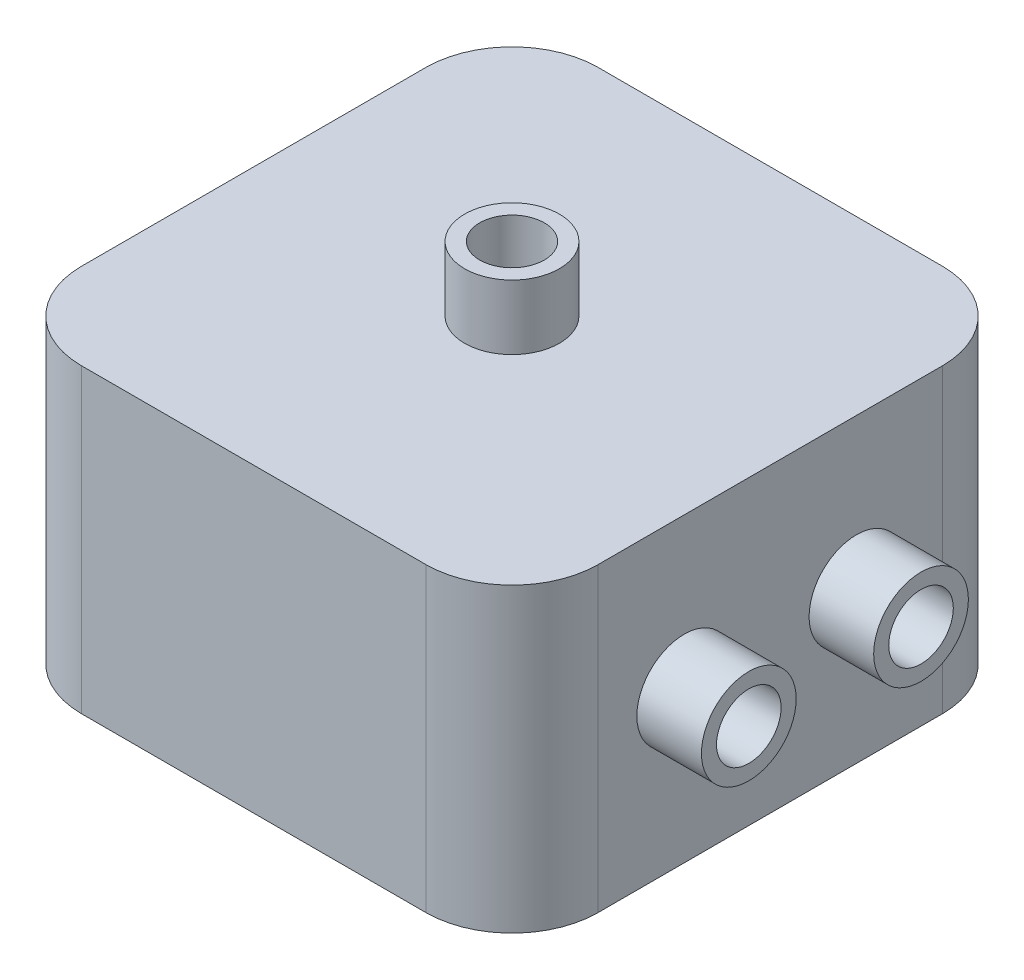
ISO-10303-21;
HEADER;
FILE_DESCRIPTION(('STEP AP214'),'2;1');
FILE_NAME('part.step','',(''),(''),'','','');
FILE_SCHEMA(('AUTOMOTIVE_DESIGN { 1 0 10303 214 1 1 1 1 }'));
ENDSEC;
DATA;
#1=APPLICATION_CONTEXT('core data for automotive mechanical design processes');
#2=APPLICATION_PROTOCOL_DEFINITION('international standard','automotive_design',2000,#1);
#3=PRODUCT_CONTEXT('',#1,'mechanical');
#4=PRODUCT('Part','Part','',(#3));
#5=PRODUCT_RELATED_PRODUCT_CATEGORY('part','',(#4));
#6=PRODUCT_DEFINITION_FORMATION('','',#4);
#7=PRODUCT_DEFINITION_CONTEXT('part definition',#1,'design');
#8=PRODUCT_DEFINITION('design','',#6,#7);
#9=PRODUCT_DEFINITION_SHAPE('','',#8);
#10=(LENGTH_UNIT() NAMED_UNIT(*) SI_UNIT(.MILLI.,.METRE.));
#11=(NAMED_UNIT(*) PLANE_ANGLE_UNIT() SI_UNIT($,.RADIAN.));
#12=(NAMED_UNIT(*) SI_UNIT($,.STERADIAN.) SOLID_ANGLE_UNIT());
#13=UNCERTAINTY_MEASURE_WITH_UNIT(LENGTH_MEASURE(1.E-05),#10,'distance_accuracy_value','');
#14=(GEOMETRIC_REPRESENTATION_CONTEXT(3) GLOBAL_UNCERTAINTY_ASSIGNED_CONTEXT((#13)) GLOBAL_UNIT_ASSIGNED_CONTEXT((#10,
#11,#12)) REPRESENTATION_CONTEXT('',''));
#15=CARTESIAN_POINT('',(0.,0.,0.));
#16=DIRECTION('',(0.,0.,1.));
#17=DIRECTION('',(1.,0.,0.));
#18=AXIS2_PLACEMENT_3D('',#15,#16,#17);
#19=CARTESIAN_POINT('',(40.,50.,-40.));
#20=DIRECTION('',(0.,-1.,0.));
#21=DIRECTION('',(0.,0.,-1.));
#22=AXIS2_PLACEMENT_3D('',#19,#20,#21);
#23=CYLINDRICAL_SURFACE('',#22,20.);
#24=DIRECTION('',(0.,-1.,0.));
#25=VECTOR('',#24,1.);
#26=CARTESIAN_POINT('',(60.,50.,-40.));
#27=LINE('',#26,#25);
#28=CARTESIAN_POINT('',(60.,60.,-40.));
#29=VERTEX_POINT('',#28);
#30=CARTESIAN_POINT('',(60.,-10.,-40.));
#31=VERTEX_POINT('',#30);
#32=EDGE_CURVE('E128',#29,#31,#27,.T.);
#33=ORIENTED_EDGE('',*,*,#32,.T.);
#34=CARTESIAN_POINT('',(40.,-10.,-40.));
#35=DIRECTION('',(0.,-1.,0.));
#36=DIRECTION('',(0.,0.,-1.));
#37=AXIS2_PLACEMENT_3D('',#34,#35,#36);
#38=CIRCLE('',#37,20.);
#39=CARTESIAN_POINT('',(40.,-10.,-60.));
#40=VERTEX_POINT('',#39);
#41=EDGE_CURVE('E212',#40,#31,#38,.T.);
#42=ORIENTED_EDGE('',*,*,#41,.F.);
#43=DIRECTION('',(0.,-1.,0.));
#44=VECTOR('',#43,1.);
#45=CARTESIAN_POINT('',(40.,50.,-60.));
#46=LINE('',#45,#44);
#47=CARTESIAN_POINT('',(40.,60.,-60.));
#48=VERTEX_POINT('',#47);
#49=EDGE_CURVE('E149',#48,#40,#46,.T.);
#50=ORIENTED_EDGE('',*,*,#49,.F.);
#51=CARTESIAN_POINT('',(40.,60.,-40.));
#52=DIRECTION('',(0.,1.,0.));
#53=DIRECTION('',(0.,0.,-1.));
#54=AXIS2_PLACEMENT_3D('',#51,#52,#53);
#55=CIRCLE('',#54,20.);
#56=EDGE_CURVE('E236',#29,#48,#55,.T.);
#57=ORIENTED_EDGE('',*,*,#56,.F.);
#58=EDGE_LOOP('',(#33,#42,#50,#57));
#59=FACE_BOUND('',#58,.T.);
#60=ADVANCED_FACE('F34',(#59),#23,.T.);
#61=CARTESIAN_POINT('',(40.,50.,-60.));
#62=DIRECTION('',(0.,0.,1.));
#63=DIRECTION('',(1.,0.,0.));
#64=AXIS2_PLACEMENT_3D('',#61,#62,#63);
#65=PLANE('',#64);
#66=ORIENTED_EDGE('',*,*,#49,.T.);
#67=DIRECTION('',(1.,0.,0.));
#68=VECTOR('',#67,1.);
#69=CARTESIAN_POINT('',(-40.,-10.,-60.));
#70=LINE('',#69,#68);
#71=CARTESIAN_POINT('',(-40.,-10.,-60.));
#72=VERTEX_POINT('',#71);
#73=EDGE_CURVE('E209',#72,#40,#70,.T.);
#74=ORIENTED_EDGE('',*,*,#73,.F.);
#75=DIRECTION('',(0.,-1.,0.));
#76=VECTOR('',#75,1.);
#77=CARTESIAN_POINT('',(-40.,50.,-60.));
#78=LINE('',#77,#76);
#79=CARTESIAN_POINT('',(-40.,60.,-60.));
#80=VERTEX_POINT('',#79);
#81=EDGE_CURVE('E146',#80,#72,#78,.T.);
#82=ORIENTED_EDGE('',*,*,#81,.F.);
#83=DIRECTION('',(-1.,0.,0.));
#84=VECTOR('',#83,1.);
#85=CARTESIAN_POINT('',(-40.,60.,-60.));
#86=LINE('',#85,#84);
#87=EDGE_CURVE('E239',#48,#80,#86,.T.);
#88=ORIENTED_EDGE('',*,*,#87,.F.);
#89=EDGE_LOOP('',(#66,#74,#82,#88));
#90=FACE_BOUND('',#89,.T.);
#91=ADVANCED_FACE('F380',(#90),#65,.F.);
#92=CARTESIAN_POINT('',(-40.,50.,-40.));
#93=DIRECTION('',(0.,-1.,0.));
#94=DIRECTION('',(0.,0.,-1.));
#95=AXIS2_PLACEMENT_3D('',#92,#93,#94);
#96=CYLINDRICAL_SURFACE('',#95,20.);
#97=ORIENTED_EDGE('',*,*,#81,.T.);
#98=CARTESIAN_POINT('',(-40.,-10.,-40.));
#99=DIRECTION('',(0.,-1.,0.));
#100=DIRECTION('',(0.,0.,-1.));
#101=AXIS2_PLACEMENT_3D('',#98,#99,#100);
#102=CIRCLE('',#101,20.);
#103=CARTESIAN_POINT('',(-60.,-10.,-40.));
#104=VERTEX_POINT('',#103);
#105=EDGE_CURVE('E206',#104,#72,#102,.T.);
#106=ORIENTED_EDGE('',*,*,#105,.F.);
#107=DIRECTION('',(0.,-1.,0.));
#108=VECTOR('',#107,1.);
#109=CARTESIAN_POINT('',(-60.,50.,-40.));
#110=LINE('',#109,#108);
#111=CARTESIAN_POINT('',(-60.,60.,-40.));
#112=VERTEX_POINT('',#111);
#113=EDGE_CURVE('E143',#112,#104,#110,.T.);
#114=ORIENTED_EDGE('',*,*,#113,.F.);
#115=CARTESIAN_POINT('',(-40.,60.,-40.));
#116=DIRECTION('',(0.,1.,0.));
#117=DIRECTION('',(0.,0.,1.));
#118=AXIS2_PLACEMENT_3D('',#115,#116,#117);
#119=CIRCLE('',#118,20.);
#120=EDGE_CURVE('E242',#80,#112,#119,.T.);
#121=ORIENTED_EDGE('',*,*,#120,.F.);
#122=EDGE_LOOP('',(#97,#106,#114,#121));
#123=FACE_BOUND('',#122,.T.);
#124=ADVANCED_FACE('F379',(#123),#96,.T.);
#125=CARTESIAN_POINT('',(-60.,50.,40.));
#126=DIRECTION('',(1.,0.,0.));
#127=DIRECTION('',(0.,0.,-1.));
#128=AXIS2_PLACEMENT_3D('',#125,#126,#127);
#129=PLANE('',#128);
#130=CARTESIAN_POINT('',(-60.,25.,-19.9999999999999));
#131=DIRECTION('',(1.,0.,0.));
#132=DIRECTION('',(0.,0.,-1.));
#133=AXIS2_PLACEMENT_3D('',#130,#131,#132);
#134=CIRCLE('',#133,11.);
#135=CARTESIAN_POINT('',(-60.,25.,-30.9999999999999));
#136=VERTEX_POINT('',#135);
#137=EDGE_CURVE('E155',#136,#136,#134,.F.);
#138=ORIENTED_EDGE('',*,*,#137,.F.);
#139=EDGE_LOOP('',(#138));
#140=FACE_BOUND('',#139,.T.);
#141=CARTESIAN_POINT('',(-60.,25.,20.));
#142=DIRECTION('',(1.,0.,0.));
#143=DIRECTION('',(0.,0.,-1.));
#144=AXIS2_PLACEMENT_3D('',#141,#142,#143);
#145=CIRCLE('',#144,11.);
#146=CARTESIAN_POINT('',(-60.,25.,8.99999999999996));
#147=VERTEX_POINT('',#146);
#148=EDGE_CURVE('E152',#147,#147,#145,.F.);
#149=ORIENTED_EDGE('',*,*,#148,.F.);
#150=EDGE_LOOP('',(#149));
#151=FACE_BOUND('',#150,.T.);
#152=ORIENTED_EDGE('',*,*,#113,.T.);
#153=DIRECTION('',(0.,0.,-1.));
#154=VECTOR('',#153,1.);
#155=CARTESIAN_POINT('',(-60.,-10.,-40.));
#156=LINE('',#155,#154);
#157=CARTESIAN_POINT('',(-60.,-10.,40.));
#158=VERTEX_POINT('',#157);
#159=EDGE_CURVE('E203',#158,#104,#156,.T.);
#160=ORIENTED_EDGE('',*,*,#159,.F.);
#161=DIRECTION('',(0.,-1.,0.));
#162=VECTOR('',#161,1.);
#163=CARTESIAN_POINT('',(-60.,50.,40.));
#164=LINE('',#163,#162);
#165=CARTESIAN_POINT('',(-60.,60.,40.));
#166=VERTEX_POINT('',#165);
#167=EDGE_CURVE('E140',#166,#158,#164,.T.);
#168=ORIENTED_EDGE('',*,*,#167,.F.);
#169=DIRECTION('',(0.,0.,1.));
#170=VECTOR('',#169,1.);
#171=CARTESIAN_POINT('',(-60.,60.,-40.));
#172=LINE('',#171,#170);
#173=EDGE_CURVE('E245',#112,#166,#172,.T.);
#174=ORIENTED_EDGE('',*,*,#173,.F.);
#175=EDGE_LOOP('',(#152,#160,#168,#174));
#176=FACE_BOUND('',#175,.T.);
#177=ADVANCED_FACE('F337',(#140,#151,#176),#129,.F.);
#178=CARTESIAN_POINT('',(-40.,50.,40.));
#179=DIRECTION('',(0.,-1.,0.));
#180=DIRECTION('',(0.,0.,-1.));
#181=AXIS2_PLACEMENT_3D('',#178,#179,#180);
#182=CYLINDRICAL_SURFACE('',#181,20.);
#183=ORIENTED_EDGE('',*,*,#167,.T.);
#184=CARTESIAN_POINT('',(-40.,-10.,40.));
#185=DIRECTION('',(0.,-1.,0.));
#186=DIRECTION('',(0.,0.,-1.));
#187=AXIS2_PLACEMENT_3D('',#184,#185,#186);
#188=CIRCLE('',#187,20.);
#189=CARTESIAN_POINT('',(-40.,-10.,60.));
#190=VERTEX_POINT('',#189);
#191=EDGE_CURVE('E200',#190,#158,#188,.T.);
#192=ORIENTED_EDGE('',*,*,#191,.F.);
#193=DIRECTION('',(0.,-1.,0.));
#194=VECTOR('',#193,1.);
#195=CARTESIAN_POINT('',(-40.,50.,60.));
#196=LINE('',#195,#194);
#197=CARTESIAN_POINT('',(-40.,60.,60.));
#198=VERTEX_POINT('',#197);
#199=EDGE_CURVE('E137',#198,#190,#196,.T.);
#200=ORIENTED_EDGE('',*,*,#199,.F.);
#201=CARTESIAN_POINT('',(-40.,60.,40.));
#202=DIRECTION('',(0.,1.,0.));
#203=DIRECTION('',(0.,0.,1.));
#204=AXIS2_PLACEMENT_3D('',#201,#202,#203);
#205=CIRCLE('',#204,20.);
#206=EDGE_CURVE('E224',#166,#198,#205,.T.);
#207=ORIENTED_EDGE('',*,*,#206,.F.);
#208=EDGE_LOOP('',(#183,#192,#200,#207));
#209=FACE_BOUND('',#208,.T.);
#210=ADVANCED_FACE('F345',(#209),#182,.T.);
#211=CARTESIAN_POINT('',(40.,50.,60.));
#212=DIRECTION('',(0.,0.,-1.));
#213=DIRECTION('',(-1.,0.,0.));
#214=AXIS2_PLACEMENT_3D('',#211,#212,#213);
#215=PLANE('',#214);
#216=ORIENTED_EDGE('',*,*,#199,.T.);
#217=DIRECTION('',(-1.,0.,0.));
#218=VECTOR('',#217,1.);
#219=CARTESIAN_POINT('',(-40.,-10.,60.));
#220=LINE('',#219,#218);
#221=CARTESIAN_POINT('',(40.,-10.,60.));
#222=VERTEX_POINT('',#221);
#223=EDGE_CURVE('E221',#222,#190,#220,.T.);
#224=ORIENTED_EDGE('',*,*,#223,.F.);
#225=DIRECTION('',(0.,-1.,0.));
#226=VECTOR('',#225,1.);
#227=CARTESIAN_POINT('',(40.,50.,60.));
#228=LINE('',#227,#226);
#229=CARTESIAN_POINT('',(40.,60.,60.));
#230=VERTEX_POINT('',#229);
#231=EDGE_CURVE('E134',#230,#222,#228,.T.);
#232=ORIENTED_EDGE('',*,*,#231,.F.);
#233=DIRECTION('',(1.,0.,0.));
#234=VECTOR('',#233,1.);
#235=CARTESIAN_POINT('',(-40.,60.,60.));
#236=LINE('',#235,#234);
#237=EDGE_CURVE('E227',#198,#230,#236,.T.);
#238=ORIENTED_EDGE('',*,*,#237,.F.);
#239=EDGE_LOOP('',(#216,#224,#232,#238));
#240=FACE_BOUND('',#239,.T.);
#241=ADVANCED_FACE('F349',(#240),#215,.F.);
#242=CARTESIAN_POINT('',(40.,50.,40.));
#243=DIRECTION('',(0.,-1.,0.));
#244=DIRECTION('',(0.,0.,-1.));
#245=AXIS2_PLACEMENT_3D('',#242,#243,#244);
#246=CYLINDRICAL_SURFACE('',#245,20.);
#247=ORIENTED_EDGE('',*,*,#231,.T.);
#248=CARTESIAN_POINT('',(40.,-10.,40.));
#249=DIRECTION('',(0.,-1.,0.));
#250=DIRECTION('',(0.,0.,-1.));
#251=AXIS2_PLACEMENT_3D('',#248,#249,#250);
#252=CIRCLE('',#251,20.);
#253=CARTESIAN_POINT('',(60.,-10.,40.));
#254=VERTEX_POINT('',#253);
#255=EDGE_CURVE('E218',#254,#222,#252,.T.);
#256=ORIENTED_EDGE('',*,*,#255,.F.);
#257=DIRECTION('',(0.,-1.,0.));
#258=VECTOR('',#257,1.);
#259=CARTESIAN_POINT('',(60.,50.,40.));
#260=LINE('',#259,#258);
#261=CARTESIAN_POINT('',(60.,60.,40.));
#262=VERTEX_POINT('',#261);
#263=EDGE_CURVE('E131',#262,#254,#260,.T.);
#264=ORIENTED_EDGE('',*,*,#263,.F.);
#265=CARTESIAN_POINT('',(40.,60.,40.));
#266=DIRECTION('',(0.,1.,0.));
#267=DIRECTION('',(0.,0.,1.));
#268=AXIS2_PLACEMENT_3D('',#265,#266,#267);
#269=CIRCLE('',#268,20.);
#270=EDGE_CURVE('E230',#230,#262,#269,.T.);
#271=ORIENTED_EDGE('',*,*,#270,.F.);
#272=EDGE_LOOP('',(#247,#256,#264,#271));
#273=FACE_BOUND('',#272,.T.);
#274=ADVANCED_FACE('F353',(#273),#246,.T.);
#275=CARTESIAN_POINT('',(60.,50.,40.));
#276=DIRECTION('',(-1.,0.,0.));
#277=DIRECTION('',(0.,0.,1.));
#278=AXIS2_PLACEMENT_3D('',#275,#276,#277);
#279=PLANE('',#278);
#280=CARTESIAN_POINT('',(60.,25.,-19.9999999999999));
#281=DIRECTION('',(-1.,0.,0.));
#282=DIRECTION('',(0.,0.,1.));
#283=AXIS2_PLACEMENT_3D('',#280,#281,#282);
#284=CIRCLE('',#283,11.);
#285=CARTESIAN_POINT('',(60.,25.,-8.99999999999994));
#286=VERTEX_POINT('',#285);
#287=EDGE_CURVE('E11',#286,#286,#284,.F.);
#288=ORIENTED_EDGE('',*,*,#287,.F.);
#289=EDGE_LOOP('',(#288));
#290=FACE_BOUND('',#289,.T.);
#291=CARTESIAN_POINT('',(60.,25.,19.9999999999999));
#292=DIRECTION('',(-1.,0.,0.));
#293=DIRECTION('',(0.,0.,1.));
#294=AXIS2_PLACEMENT_3D('',#291,#292,#293);
#295=CIRCLE('',#294,11.);
#296=CARTESIAN_POINT('',(60.,25.,30.9999999999999));
#297=VERTEX_POINT('',#296);
#298=EDGE_CURVE('E43',#297,#297,#295,.F.);
#299=ORIENTED_EDGE('',*,*,#298,.F.);
#300=EDGE_LOOP('',(#299));
#301=FACE_BOUND('',#300,.T.);
#302=ORIENTED_EDGE('',*,*,#263,.T.);
#303=DIRECTION('',(0.,0.,1.));
#304=VECTOR('',#303,1.);
#305=CARTESIAN_POINT('',(60.,-10.,-40.));
#306=LINE('',#305,#304);
#307=EDGE_CURVE('E215',#31,#254,#306,.T.);
#308=ORIENTED_EDGE('',*,*,#307,.F.);
#309=ORIENTED_EDGE('',*,*,#32,.F.);
#310=DIRECTION('',(0.,0.,-1.));
#311=VECTOR('',#310,1.);
#312=CARTESIAN_POINT('',(60.,60.,-40.));
#313=LINE('',#312,#311);
#314=EDGE_CURVE('E233',#262,#29,#313,.T.);
#315=ORIENTED_EDGE('',*,*,#314,.F.);
#316=EDGE_LOOP('',(#302,#308,#309,#315));
#317=FACE_BOUND('',#316,.T.);
#318=ADVANCED_FACE('F358',(#290,#301,#317),#279,.F.);
#319=CARTESIAN_POINT('',(-40.,60.,40.));
#320=DIRECTION('',(0.,1.,0.));
#321=DIRECTION('',(0.,0.,1.));
#322=AXIS2_PLACEMENT_3D('',#319,#320,#321);
#323=PLANE('',#322);
#324=CARTESIAN_POINT('',(0.,60.,0.));
#325=DIRECTION('',(0.,1.,0.));
#326=DIRECTION('',(0.,0.,1.));
#327=AXIS2_PLACEMENT_3D('',#324,#325,#326);
#328=CIRCLE('',#327,11.);
#329=CARTESIAN_POINT('',(0.,60.,11.));
#330=VERTEX_POINT('',#329);
#331=EDGE_CURVE('E177',#330,#330,#328,.T.);
#332=ORIENTED_EDGE('',*,*,#331,.F.);
#333=EDGE_LOOP('',(#332));
#334=FACE_BOUND('',#333,.T.);
#335=ORIENTED_EDGE('',*,*,#206,.T.);
#336=ORIENTED_EDGE('',*,*,#237,.T.);
#337=ORIENTED_EDGE('',*,*,#270,.T.);
#338=ORIENTED_EDGE('',*,*,#314,.T.);
#339=ORIENTED_EDGE('',*,*,#56,.T.);
#340=ORIENTED_EDGE('',*,*,#87,.T.);
#341=ORIENTED_EDGE('',*,*,#120,.T.);
#342=ORIENTED_EDGE('',*,*,#173,.T.);
#343=EDGE_LOOP('',(#335,#336,#337,#338,#339,#340,#341,#342));
#344=FACE_BOUND('',#343,.T.);
#345=ADVANCED_FACE('F343',(#334,#344),#323,.T.);
#346=CARTESIAN_POINT('',(-40.,-10.,40.));
#347=DIRECTION('',(0.,-1.,0.));
#348=DIRECTION('',(0.,0.,-1.));
#349=AXIS2_PLACEMENT_3D('',#346,#347,#348);
#350=PLANE('',#349);
#351=ORIENTED_EDGE('',*,*,#191,.T.);
#352=ORIENTED_EDGE('',*,*,#159,.T.);
#353=ORIENTED_EDGE('',*,*,#105,.T.);
#354=ORIENTED_EDGE('',*,*,#73,.T.);
#355=ORIENTED_EDGE('',*,*,#41,.T.);
#356=ORIENTED_EDGE('',*,*,#307,.T.);
#357=ORIENTED_EDGE('',*,*,#255,.T.);
#358=ORIENTED_EDGE('',*,*,#223,.T.);
#359=EDGE_LOOP('',(#351,#352,#353,#354,#355,#356,#357,#358));
#360=FACE_BOUND('',#359,.T.);
#361=ADVANCED_FACE('F362',(#360),#350,.T.);
#362=CARTESIAN_POINT('',(-75.,25.,20.));
#363=DIRECTION('',(1.,0.,0.));
#364=DIRECTION('',(0.,0.,-1.));
#365=AXIS2_PLACEMENT_3D('',#362,#363,#364);
#366=CYLINDRICAL_SURFACE('',#365,11.);
#367=CARTESIAN_POINT('',(-75.,25.,20.));
#368=DIRECTION('',(-1.,0.,0.));
#369=DIRECTION('',(0.,0.,1.));
#370=AXIS2_PLACEMENT_3D('',#367,#368,#369);
#371=CIRCLE('',#370,11.);
#372=CARTESIAN_POINT('',(-75.,25.,31.));
#373=VERTEX_POINT('',#372);
#374=EDGE_CURVE('E197',#373,#373,#371,.T.);
#375=ORIENTED_EDGE('',*,*,#374,.F.);
#376=EDGE_LOOP('',(#375));
#377=FACE_BOUND('',#376,.T.);
#378=ORIENTED_EDGE('',*,*,#148,.T.);
#379=EDGE_LOOP('',(#378));
#380=FACE_BOUND('',#379,.T.);
#381=ADVANCED_FACE('F433',(#377,#380),#366,.T.);
#382=CARTESIAN_POINT('',(-75.,25.,20.));
#383=DIRECTION('',(-1.,0.,0.));
#384=DIRECTION('',(0.,0.,1.));
#385=AXIS2_PLACEMENT_3D('',#382,#383,#384);
#386=PLANE('',#385);
#387=CARTESIAN_POINT('',(-75.,25.,20.));
#388=DIRECTION('',(-1.,0.,0.));
#389=DIRECTION('',(0.,0.,1.));
#390=AXIS2_PLACEMENT_3D('',#387,#388,#389);
#391=CIRCLE('',#390,7.5);
#392=CARTESIAN_POINT('',(-75.,25.,27.5));
#393=VERTEX_POINT('',#392);
#394=EDGE_CURVE('E162',#393,#393,#391,.T.);
#395=ORIENTED_EDGE('',*,*,#394,.F.);
#396=EDGE_LOOP('',(#395));
#397=FACE_BOUND('',#396,.T.);
#398=ORIENTED_EDGE('',*,*,#374,.T.);
#399=EDGE_LOOP('',(#398));
#400=FACE_BOUND('',#399,.T.);
#401=ADVANCED_FACE('F436',(#397,#400),#386,.T.);
#402=CARTESIAN_POINT('',(-75.,25.,-19.9999999999999));
#403=DIRECTION('',(1.,0.,0.));
#404=DIRECTION('',(0.,0.,-1.));
#405=AXIS2_PLACEMENT_3D('',#402,#403,#404);
#406=CYLINDRICAL_SURFACE('',#405,11.);
#407=CARTESIAN_POINT('',(-75.,25.,-19.9999999999999));
#408=DIRECTION('',(-1.,0.,0.));
#409=DIRECTION('',(0.,0.,-1.));
#410=AXIS2_PLACEMENT_3D('',#407,#408,#409);
#411=CIRCLE('',#410,11.);
#412=CARTESIAN_POINT('',(-75.,25.,-30.9999999999999));
#413=VERTEX_POINT('',#412);
#414=EDGE_CURVE('E194',#413,#413,#411,.T.);
#415=ORIENTED_EDGE('',*,*,#414,.F.);
#416=EDGE_LOOP('',(#415));
#417=FACE_BOUND('',#416,.T.);
#418=ORIENTED_EDGE('',*,*,#137,.T.);
#419=EDGE_LOOP('',(#418));
#420=FACE_BOUND('',#419,.T.);
#421=ADVANCED_FACE('F440',(#417,#420),#406,.T.);
#422=CARTESIAN_POINT('',(-75.,25.,-19.9999999999999));
#423=DIRECTION('',(1.,0.,0.));
#424=DIRECTION('',(0.,0.,-1.));
#425=AXIS2_PLACEMENT_3D('',#422,#423,#424);
#426=PLANE('',#425);
#427=CARTESIAN_POINT('',(-75.,25.,-19.9999999999999));
#428=DIRECTION('',(-1.,0.,0.));
#429=DIRECTION('',(0.,0.,1.));
#430=AXIS2_PLACEMENT_3D('',#427,#428,#429);
#431=CIRCLE('',#430,7.5);
#432=CARTESIAN_POINT('',(-75.,25.,-12.4999999999999));
#433=VERTEX_POINT('',#432);
#434=EDGE_CURVE('E169',#433,#433,#431,.T.);
#435=ORIENTED_EDGE('',*,*,#434,.F.);
#436=EDGE_LOOP('',(#435));
#437=FACE_BOUND('',#436,.T.);
#438=ORIENTED_EDGE('',*,*,#414,.T.);
#439=EDGE_LOOP('',(#438));
#440=FACE_BOUND('',#439,.T.);
#441=ADVANCED_FACE('F444',(#437,#440),#426,.F.);
#442=CARTESIAN_POINT('',(75.,25.,19.9999999999999));
#443=DIRECTION('',(-1.,0.,0.));
#444=DIRECTION('',(0.,0.,1.));
#445=AXIS2_PLACEMENT_3D('',#442,#443,#444);
#446=CYLINDRICAL_SURFACE('',#445,11.);
#447=CARTESIAN_POINT('',(75.,25.,19.9999999999999));
#448=DIRECTION('',(1.,0.,0.));
#449=DIRECTION('',(0.,0.,-1.));
#450=AXIS2_PLACEMENT_3D('',#447,#448,#449);
#451=CIRCLE('',#450,11.);
#452=CARTESIAN_POINT('',(75.,25.,8.99999999999994));
#453=VERTEX_POINT('',#452);
#454=EDGE_CURVE('E191',#453,#453,#451,.T.);
#455=ORIENTED_EDGE('',*,*,#454,.F.);
#456=EDGE_LOOP('',(#455));
#457=FACE_BOUND('',#456,.T.);
#458=ORIENTED_EDGE('',*,*,#298,.T.);
#459=EDGE_LOOP('',(#458));
#460=FACE_BOUND('',#459,.T.);
#461=ADVANCED_FACE('F448',(#457,#460),#446,.T.);
#462=CARTESIAN_POINT('',(75.,25.,19.9999999999999));
#463=DIRECTION('',(1.,0.,0.));
#464=DIRECTION('',(0.,0.,-1.));
#465=AXIS2_PLACEMENT_3D('',#462,#463,#464);
#466=PLANE('',#465);
#467=CARTESIAN_POINT('',(75.,25.,20.));
#468=DIRECTION('',(1.,0.,0.));
#469=DIRECTION('',(0.,0.,-1.));
#470=AXIS2_PLACEMENT_3D('',#467,#468,#469);
#471=CIRCLE('',#470,7.5);
#472=CARTESIAN_POINT('',(75.,25.,12.5));
#473=VERTEX_POINT('',#472);
#474=EDGE_CURVE('E185',#473,#473,#471,.T.);
#475=ORIENTED_EDGE('',*,*,#474,.F.);
#476=EDGE_LOOP('',(#475));
#477=FACE_BOUND('',#476,.T.);
#478=ORIENTED_EDGE('',*,*,#454,.T.);
#479=EDGE_LOOP('',(#478));
#480=FACE_BOUND('',#479,.T.);
#481=ADVANCED_FACE('F452',(#477,#480),#466,.T.);
#482=CARTESIAN_POINT('',(75.,25.,-19.9999999999999));
#483=DIRECTION('',(-1.,0.,0.));
#484=DIRECTION('',(0.,0.,1.));
#485=AXIS2_PLACEMENT_3D('',#482,#483,#484);
#486=CYLINDRICAL_SURFACE('',#485,11.);
#487=CARTESIAN_POINT('',(75.,25.,-19.9999999999999));
#488=DIRECTION('',(1.,0.,0.));
#489=DIRECTION('',(0.,0.,-1.));
#490=AXIS2_PLACEMENT_3D('',#487,#488,#489);
#491=CIRCLE('',#490,11.);
#492=CARTESIAN_POINT('',(75.,25.,-30.9999999999999));
#493=VERTEX_POINT('',#492);
#494=EDGE_CURVE('E188',#493,#493,#491,.T.);
#495=ORIENTED_EDGE('',*,*,#494,.F.);
#496=EDGE_LOOP('',(#495));
#497=FACE_BOUND('',#496,.T.);
#498=ORIENTED_EDGE('',*,*,#287,.T.);
#499=EDGE_LOOP('',(#498));
#500=FACE_BOUND('',#499,.T.);
#501=ADVANCED_FACE('F456',(#497,#500),#486,.T.);
#502=CARTESIAN_POINT('',(75.,25.,-19.9999999999999));
#503=DIRECTION('',(1.,0.,0.));
#504=DIRECTION('',(0.,0.,-1.));
#505=AXIS2_PLACEMENT_3D('',#502,#503,#504);
#506=PLANE('',#505);
#507=CARTESIAN_POINT('',(75.,25.,-19.9999999999999));
#508=DIRECTION('',(1.,0.,0.));
#509=DIRECTION('',(0.,0.,-1.));
#510=AXIS2_PLACEMENT_3D('',#507,#508,#509);
#511=CIRCLE('',#510,7.5);
#512=CARTESIAN_POINT('',(75.,25.,-27.4999999999999));
#513=VERTEX_POINT('',#512);
#514=EDGE_CURVE('E166',#513,#513,#511,.T.);
#515=ORIENTED_EDGE('',*,*,#514,.F.);
#516=EDGE_LOOP('',(#515));
#517=FACE_BOUND('',#516,.T.);
#518=ORIENTED_EDGE('',*,*,#494,.T.);
#519=EDGE_LOOP('',(#518));
#520=FACE_BOUND('',#519,.T.);
#521=ADVANCED_FACE('F460',(#517,#520),#506,.T.);
#522=CARTESIAN_POINT('',(125.,25.,-19.9999999999999));
#523=DIRECTION('',(-1.,0.,0.));
#524=DIRECTION('',(0.,0.,1.));
#525=AXIS2_PLACEMENT_3D('',#522,#523,#524);
#526=CYLINDRICAL_SURFACE('',#525,7.5);
#527=ORIENTED_EDGE('',*,*,#514,.T.);
#528=EDGE_LOOP('',(#527));
#529=FACE_BOUND('',#528,.T.);
#530=CARTESIAN_POINT('',(50.,25.,-19.9999999999999));
#531=DIRECTION('',(-1.,0.,0.));
#532=DIRECTION('',(0.,0.,1.));
#533=AXIS2_PLACEMENT_3D('',#530,#531,#532);
#534=CIRCLE('',#533,7.5);
#535=CARTESIAN_POINT('',(50.,25.,-12.4999999999999));
#536=VERTEX_POINT('',#535);
#537=EDGE_CURVE('E159',#536,#536,#534,.T.);
#538=ORIENTED_EDGE('',*,*,#537,.T.);
#539=EDGE_LOOP('',(#538));
#540=FACE_BOUND('',#539,.T.);
#541=ADVANCED_FACE('F464',(#529,#540),#526,.F.);
#542=CARTESIAN_POINT('',(125.,25.,20.));
#543=DIRECTION('',(-1.,0.,0.));
#544=DIRECTION('',(0.,0.,1.));
#545=AXIS2_PLACEMENT_3D('',#542,#543,#544);
#546=CYLINDRICAL_SURFACE('',#545,7.5);
#547=ORIENTED_EDGE('',*,*,#474,.T.);
#548=EDGE_LOOP('',(#547));
#549=FACE_BOUND('',#548,.T.);
#550=CARTESIAN_POINT('',(50.,25.,20.));
#551=DIRECTION('',(-1.,0.,0.));
#552=DIRECTION('',(0.,0.,1.));
#553=AXIS2_PLACEMENT_3D('',#550,#551,#552);
#554=CIRCLE('',#553,7.5);
#555=CARTESIAN_POINT('',(50.,25.,27.5));
#556=VERTEX_POINT('',#555);
#557=EDGE_CURVE('E37',#556,#556,#554,.T.);
#558=ORIENTED_EDGE('',*,*,#557,.T.);
#559=EDGE_LOOP('',(#558));
#560=FACE_BOUND('',#559,.T.);
#561=ADVANCED_FACE('F468',(#549,#560),#546,.F.);
#562=CARTESIAN_POINT('',(-50.,25.,-19.9999999999999));
#563=DIRECTION('',(1.,0.,0.));
#564=DIRECTION('',(0.,0.,-1.));
#565=AXIS2_PLACEMENT_3D('',#562,#563,#564);
#566=CIRCLE('',#565,7.5);
#567=CARTESIAN_POINT('',(-50.,25.,-27.4999999999999));
#568=VERTEX_POINT('',#567);
#569=EDGE_CURVE('E161',#568,#568,#566,.T.);
#570=ORIENTED_EDGE('',*,*,#569,.T.);
#571=EDGE_LOOP('',(#570));
#572=FACE_BOUND('',#571,.T.);
#573=ORIENTED_EDGE('',*,*,#434,.T.);
#574=EDGE_LOOP('',(#573));
#575=FACE_BOUND('',#574,.T.);
#576=ADVANCED_FACE('F470',(#572,#575),#526,.F.);
#577=CARTESIAN_POINT('',(-50.,25.,20.));
#578=DIRECTION('',(1.,0.,0.));
#579=DIRECTION('',(0.,0.,-1.));
#580=AXIS2_PLACEMENT_3D('',#577,#578,#579);
#581=CIRCLE('',#580,7.5);
#582=CARTESIAN_POINT('',(-50.,25.,12.5));
#583=VERTEX_POINT('',#582);
#584=EDGE_CURVE('E182',#583,#583,#581,.T.);
#585=ORIENTED_EDGE('',*,*,#584,.T.);
#586=EDGE_LOOP('',(#585));
#587=FACE_BOUND('',#586,.T.);
#588=ORIENTED_EDGE('',*,*,#394,.T.);
#589=EDGE_LOOP('',(#588));
#590=FACE_BOUND('',#589,.T.);
#591=ADVANCED_FACE('F430',(#587,#590),#546,.F.);
#592=CARTESIAN_POINT('',(-40.,0.,40.));
#593=DIRECTION('',(0.,-1.,0.));
#594=DIRECTION('',(0.,0.,-1.));
#595=AXIS2_PLACEMENT_3D('',#592,#593,#594);
#596=PLANE('',#595);
#597=DIRECTION('',(0.,0.,1.));
#598=VECTOR('',#597,1.);
#599=CARTESIAN_POINT('',(-50.,0.,40.));
#600=LINE('',#599,#598);
#601=CARTESIAN_POINT('',(-50.,0.,-40.));
#602=VERTEX_POINT('',#601);
#603=CARTESIAN_POINT('',(-50.,0.,40.));
#604=VERTEX_POINT('',#603);
#605=EDGE_CURVE('E100',#602,#604,#600,.T.);
#606=ORIENTED_EDGE('',*,*,#605,.T.);
#607=CARTESIAN_POINT('',(-40.,0.,40.));
#608=DIRECTION('',(0.,1.,0.));
#609=DIRECTION('',(0.,0.,-1.));
#610=AXIS2_PLACEMENT_3D('',#607,#608,#609);
#611=CIRCLE('',#610,10.);
#612=CARTESIAN_POINT('',(-40.,0.,50.));
#613=VERTEX_POINT('',#612);
#614=EDGE_CURVE('E248',#604,#613,#611,.T.);
#615=ORIENTED_EDGE('',*,*,#614,.T.);
#616=DIRECTION('',(1.,0.,0.));
#617=VECTOR('',#616,1.);
#618=CARTESIAN_POINT('',(40.,0.,50.));
#619=LINE('',#618,#617);
#620=CARTESIAN_POINT('',(40.,0.,50.));
#621=VERTEX_POINT('',#620);
#622=EDGE_CURVE('E267',#613,#621,#619,.T.);
#623=ORIENTED_EDGE('',*,*,#622,.T.);
#624=CARTESIAN_POINT('',(40.,0.,40.));
#625=DIRECTION('',(0.,1.,0.));
#626=DIRECTION('',(0.,0.,-1.));
#627=AXIS2_PLACEMENT_3D('',#624,#625,#626);
#628=CIRCLE('',#627,10.);
#629=CARTESIAN_POINT('',(50.,0.,40.));
#630=VERTEX_POINT('',#629);
#631=EDGE_CURVE('E270',#621,#630,#628,.T.);
#632=ORIENTED_EDGE('',*,*,#631,.T.);
#633=DIRECTION('',(0.,0.,-1.));
#634=VECTOR('',#633,1.);
#635=CARTESIAN_POINT('',(50.,0.,40.));
#636=LINE('',#635,#634);
#637=CARTESIAN_POINT('',(50.,0.,-40.));
#638=VERTEX_POINT('',#637);
#639=EDGE_CURVE('E107',#630,#638,#636,.T.);
#640=ORIENTED_EDGE('',*,*,#639,.T.);
#641=CARTESIAN_POINT('',(40.,0.,-40.));
#642=DIRECTION('',(0.,1.,0.));
#643=DIRECTION('',(0.,0.,1.));
#644=AXIS2_PLACEMENT_3D('',#641,#642,#643);
#645=CIRCLE('',#644,10.);
#646=CARTESIAN_POINT('',(40.,0.,-50.));
#647=VERTEX_POINT('',#646);
#648=EDGE_CURVE('E105',#638,#647,#645,.T.);
#649=ORIENTED_EDGE('',*,*,#648,.T.);
#650=DIRECTION('',(-1.,0.,0.));
#651=VECTOR('',#650,1.);
#652=CARTESIAN_POINT('',(40.,0.,-50.));
#653=LINE('',#652,#651);
#654=CARTESIAN_POINT('',(-40.,0.,-50.));
#655=VERTEX_POINT('',#654);
#656=EDGE_CURVE('E83',#647,#655,#653,.T.);
#657=ORIENTED_EDGE('',*,*,#656,.T.);
#658=CARTESIAN_POINT('',(-40.,0.,-40.));
#659=DIRECTION('',(0.,1.,0.));
#660=DIRECTION('',(0.,0.,1.));
#661=AXIS2_PLACEMENT_3D('',#658,#659,#660);
#662=CIRCLE('',#661,9.99999999999999);
#663=EDGE_CURVE('E94',#655,#602,#662,.T.);
#664=ORIENTED_EDGE('',*,*,#663,.T.);
#665=EDGE_LOOP('',(#606,#615,#623,#632,#640,#649,#657,#664));
#666=FACE_BOUND('',#665,.T.);
#667=ADVANCED_FACE('F102',(#666),#596,.F.);
#668=CARTESIAN_POINT('',(-40.,50.,40.));
#669=DIRECTION('',(0.,1.,0.));
#670=DIRECTION('',(0.,0.,1.));
#671=AXIS2_PLACEMENT_3D('',#668,#669,#670);
#672=PLANE('',#671);
#673=CARTESIAN_POINT('',(0.,50.,0.));
#674=DIRECTION('',(0.,1.,0.));
#675=DIRECTION('',(0.,0.,1.));
#676=AXIS2_PLACEMENT_3D('',#673,#674,#675);
#677=CIRCLE('',#676,7.5);
#678=CARTESIAN_POINT('',(0.,50.,7.5));
#679=VERTEX_POINT('',#678);
#680=EDGE_CURVE('E492',#679,#679,#677,.T.);
#681=ORIENTED_EDGE('',*,*,#680,.T.);
#682=EDGE_LOOP('',(#681));
#683=FACE_BOUND('',#682,.T.);
#684=DIRECTION('',(1.,0.,0.));
#685=VECTOR('',#684,1.);
#686=CARTESIAN_POINT('',(40.,50.,50.));
#687=LINE('',#686,#685);
#688=CARTESIAN_POINT('',(-40.,50.,50.));
#689=VERTEX_POINT('',#688);
#690=CARTESIAN_POINT('',(40.,50.,50.));
#691=VERTEX_POINT('',#690);
#692=EDGE_CURVE('E251',#689,#691,#687,.T.);
#693=ORIENTED_EDGE('',*,*,#692,.F.);
#694=CARTESIAN_POINT('',(-40.,50.,40.));
#695=DIRECTION('',(0.,1.,0.));
#696=DIRECTION('',(0.,0.,-1.));
#697=AXIS2_PLACEMENT_3D('',#694,#695,#696);
#698=CIRCLE('',#697,10.);
#699=CARTESIAN_POINT('',(-50.,50.,40.));
#700=VERTEX_POINT('',#699);
#701=EDGE_CURVE('E112',#700,#689,#698,.T.);
#702=ORIENTED_EDGE('',*,*,#701,.F.);
#703=DIRECTION('',(0.,0.,1.));
#704=VECTOR('',#703,1.);
#705=CARTESIAN_POINT('',(-50.,50.,40.));
#706=LINE('',#705,#704);
#707=CARTESIAN_POINT('',(-50.,50.,-40.));
#708=VERTEX_POINT('',#707);
#709=EDGE_CURVE('E116',#708,#700,#706,.T.);
#710=ORIENTED_EDGE('',*,*,#709,.F.);
#711=CARTESIAN_POINT('',(-40.,50.,-40.));
#712=DIRECTION('',(0.,1.,0.));
#713=DIRECTION('',(0.,0.,1.));
#714=AXIS2_PLACEMENT_3D('',#711,#712,#713);
#715=CIRCLE('',#714,9.99999999999999);
#716=CARTESIAN_POINT('',(-40.,50.,-50.));
#717=VERTEX_POINT('',#716);
#718=EDGE_CURVE('E261',#717,#708,#715,.T.);
#719=ORIENTED_EDGE('',*,*,#718,.F.);
#720=DIRECTION('',(-1.,0.,0.));
#721=VECTOR('',#720,1.);
#722=CARTESIAN_POINT('',(40.,50.,-50.));
#723=LINE('',#722,#721);
#724=CARTESIAN_POINT('',(40.,50.,-50.));
#725=VERTEX_POINT('',#724);
#726=EDGE_CURVE('E87',#725,#717,#723,.T.);
#727=ORIENTED_EDGE('',*,*,#726,.F.);
#728=CARTESIAN_POINT('',(40.,50.,-40.));
#729=DIRECTION('',(0.,1.,0.));
#730=DIRECTION('',(0.,0.,1.));
#731=AXIS2_PLACEMENT_3D('',#728,#729,#730);
#732=CIRCLE('',#731,10.);
#733=CARTESIAN_POINT('',(50.,50.,-40.));
#734=VERTEX_POINT('',#733);
#735=EDGE_CURVE('E257',#734,#725,#732,.T.);
#736=ORIENTED_EDGE('',*,*,#735,.F.);
#737=DIRECTION('',(0.,0.,-1.));
#738=VECTOR('',#737,1.);
#739=CARTESIAN_POINT('',(50.,50.,40.));
#740=LINE('',#739,#738);
#741=CARTESIAN_POINT('',(50.,50.,40.));
#742=VERTEX_POINT('',#741);
#743=EDGE_CURVE('E51',#742,#734,#740,.T.);
#744=ORIENTED_EDGE('',*,*,#743,.F.);
#745=CARTESIAN_POINT('',(40.,50.,40.));
#746=DIRECTION('',(0.,1.,0.));
#747=DIRECTION('',(0.,0.,-1.));
#748=AXIS2_PLACEMENT_3D('',#745,#746,#747);
#749=CIRCLE('',#748,10.);
#750=EDGE_CURVE('E254',#691,#742,#749,.T.);
#751=ORIENTED_EDGE('',*,*,#750,.F.);
#752=EDGE_LOOP('',(#693,#702,#710,#719,#727,#736,#744,#751));
#753=FACE_BOUND('',#752,.T.);
#754=ADVANCED_FACE('F294',(#683,#753),#672,.F.);
#755=CARTESIAN_POINT('',(-50.,50.,40.));
#756=DIRECTION('',(1.,0.,0.));
#757=DIRECTION('',(0.,0.,-1.));
#758=AXIS2_PLACEMENT_3D('',#755,#756,#757);
#759=PLANE('',#758);
#760=ORIENTED_EDGE('',*,*,#584,.F.);
#761=EDGE_LOOP('',(#760));
#762=FACE_BOUND('',#761,.T.);
#763=ORIENTED_EDGE('',*,*,#569,.F.);
#764=EDGE_LOOP('',(#763));
#765=FACE_BOUND('',#764,.T.);
#766=ORIENTED_EDGE('',*,*,#605,.F.);
#767=DIRECTION('',(0.,-1.,0.));
#768=VECTOR('',#767,1.);
#769=CARTESIAN_POINT('',(-50.,50.,-40.));
#770=LINE('',#769,#768);
#771=EDGE_CURVE('E91',#708,#602,#770,.T.);
#772=ORIENTED_EDGE('',*,*,#771,.F.);
#773=ORIENTED_EDGE('',*,*,#709,.T.);
#774=DIRECTION('',(0.,-1.,0.));
#775=VECTOR('',#774,1.);
#776=CARTESIAN_POINT('',(-50.,50.,40.));
#777=LINE('',#776,#775);
#778=EDGE_CURVE('E113',#700,#604,#777,.T.);
#779=ORIENTED_EDGE('',*,*,#778,.T.);
#780=EDGE_LOOP('',(#766,#772,#773,#779));
#781=FACE_BOUND('',#780,.T.);
#782=ADVANCED_FACE('F418',(#762,#765,#781),#759,.T.);
#783=CARTESIAN_POINT('',(-40.,50.,-40.));
#784=DIRECTION('',(0.,-1.,0.));
#785=DIRECTION('',(0.,0.,-1.));
#786=AXIS2_PLACEMENT_3D('',#783,#784,#785);
#787=CYLINDRICAL_SURFACE('',#786,9.99999999999999);
#788=ORIENTED_EDGE('',*,*,#663,.F.);
#789=DIRECTION('',(0.,-1.,0.));
#790=VECTOR('',#789,1.);
#791=CARTESIAN_POINT('',(-40.,50.,-50.));
#792=LINE('',#791,#790);
#793=EDGE_CURVE('E78',#717,#655,#792,.T.);
#794=ORIENTED_EDGE('',*,*,#793,.F.);
#795=ORIENTED_EDGE('',*,*,#718,.T.);
#796=ORIENTED_EDGE('',*,*,#771,.T.);
#797=EDGE_LOOP('',(#788,#794,#795,#796));
#798=FACE_BOUND('',#797,.T.);
#799=ADVANCED_FACE('F95',(#798),#787,.F.);
#800=CARTESIAN_POINT('',(40.,50.,-50.));
#801=DIRECTION('',(0.,0.,1.));
#802=DIRECTION('',(1.,0.,0.));
#803=AXIS2_PLACEMENT_3D('',#800,#801,#802);
#804=PLANE('',#803);
#805=ORIENTED_EDGE('',*,*,#656,.F.);
#806=DIRECTION('',(0.,-1.,0.));
#807=VECTOR('',#806,1.);
#808=CARTESIAN_POINT('',(40.,50.,-50.));
#809=LINE('',#808,#807);
#810=EDGE_CURVE('E90',#725,#647,#809,.T.);
#811=ORIENTED_EDGE('',*,*,#810,.F.);
#812=ORIENTED_EDGE('',*,*,#726,.T.);
#813=ORIENTED_EDGE('',*,*,#793,.T.);
#814=EDGE_LOOP('',(#805,#811,#812,#813));
#815=FACE_BOUND('',#814,.T.);
#816=ADVANCED_FACE('F80',(#815),#804,.T.);
#817=CARTESIAN_POINT('',(40.,50.,-40.));
#818=DIRECTION('',(0.,-1.,0.));
#819=DIRECTION('',(0.,0.,-1.));
#820=AXIS2_PLACEMENT_3D('',#817,#818,#819);
#821=CYLINDRICAL_SURFACE('',#820,10.);
#822=ORIENTED_EDGE('',*,*,#648,.F.);
#823=DIRECTION('',(0.,-1.,0.));
#824=VECTOR('',#823,1.);
#825=CARTESIAN_POINT('',(50.,50.,-40.));
#826=LINE('',#825,#824);
#827=EDGE_CURVE('E119',#734,#638,#826,.T.);
#828=ORIENTED_EDGE('',*,*,#827,.F.);
#829=ORIENTED_EDGE('',*,*,#735,.T.);
#830=ORIENTED_EDGE('',*,*,#810,.T.);
#831=EDGE_LOOP('',(#822,#828,#829,#830));
#832=FACE_BOUND('',#831,.T.);
#833=ADVANCED_FACE('F280',(#832),#821,.F.);
#834=CARTESIAN_POINT('',(50.,50.,40.));
#835=DIRECTION('',(-1.,0.,0.));
#836=DIRECTION('',(0.,0.,1.));
#837=AXIS2_PLACEMENT_3D('',#834,#835,#836);
#838=PLANE('',#837);
#839=ORIENTED_EDGE('',*,*,#557,.F.);
#840=EDGE_LOOP('',(#839));
#841=FACE_BOUND('',#840,.T.);
#842=ORIENTED_EDGE('',*,*,#537,.F.);
#843=EDGE_LOOP('',(#842));
#844=FACE_BOUND('',#843,.T.);
#845=ORIENTED_EDGE('',*,*,#639,.F.);
#846=DIRECTION('',(0.,-1.,0.));
#847=VECTOR('',#846,1.);
#848=CARTESIAN_POINT('',(50.,50.,40.));
#849=LINE('',#848,#847);
#850=EDGE_CURVE('E121',#742,#630,#849,.T.);
#851=ORIENTED_EDGE('',*,*,#850,.F.);
#852=ORIENTED_EDGE('',*,*,#743,.T.);
#853=ORIENTED_EDGE('',*,*,#827,.T.);
#854=EDGE_LOOP('',(#845,#851,#852,#853));
#855=FACE_BOUND('',#854,.T.);
#856=ADVANCED_FACE('F276',(#841,#844,#855),#838,.T.);
#857=CARTESIAN_POINT('',(40.,50.,40.));
#858=DIRECTION('',(0.,-1.,0.));
#859=DIRECTION('',(0.,0.,-1.));
#860=AXIS2_PLACEMENT_3D('',#857,#858,#859);
#861=CYLINDRICAL_SURFACE('',#860,10.);
#862=ORIENTED_EDGE('',*,*,#631,.F.);
#863=DIRECTION('',(0.,-1.,0.));
#864=VECTOR('',#863,1.);
#865=CARTESIAN_POINT('',(40.,50.,50.));
#866=LINE('',#865,#864);
#867=EDGE_CURVE('E123',#691,#621,#866,.T.);
#868=ORIENTED_EDGE('',*,*,#867,.F.);
#869=ORIENTED_EDGE('',*,*,#750,.T.);
#870=ORIENTED_EDGE('',*,*,#850,.T.);
#871=EDGE_LOOP('',(#862,#868,#869,#870));
#872=FACE_BOUND('',#871,.T.);
#873=ADVANCED_FACE('F405',(#872),#861,.F.);
#874=CARTESIAN_POINT('',(40.,50.,50.));
#875=DIRECTION('',(0.,0.,-1.));
#876=DIRECTION('',(-1.,0.,0.));
#877=AXIS2_PLACEMENT_3D('',#874,#875,#876);
#878=PLANE('',#877);
#879=ORIENTED_EDGE('',*,*,#622,.F.);
#880=DIRECTION('',(0.,-1.,0.));
#881=VECTOR('',#880,1.);
#882=CARTESIAN_POINT('',(-40.,50.,50.));
#883=LINE('',#882,#881);
#884=EDGE_CURVE('E125',#689,#613,#883,.T.);
#885=ORIENTED_EDGE('',*,*,#884,.F.);
#886=ORIENTED_EDGE('',*,*,#692,.T.);
#887=ORIENTED_EDGE('',*,*,#867,.T.);
#888=EDGE_LOOP('',(#879,#885,#886,#887));
#889=FACE_BOUND('',#888,.T.);
#890=ADVANCED_FACE('F302',(#889),#878,.T.);
#891=CARTESIAN_POINT('',(-40.,50.,40.));
#892=DIRECTION('',(0.,-1.,0.));
#893=DIRECTION('',(0.,0.,-1.));
#894=AXIS2_PLACEMENT_3D('',#891,#892,#893);
#895=CYLINDRICAL_SURFACE('',#894,10.);
#896=ORIENTED_EDGE('',*,*,#614,.F.);
#897=ORIENTED_EDGE('',*,*,#778,.F.);
#898=ORIENTED_EDGE('',*,*,#701,.T.);
#899=ORIENTED_EDGE('',*,*,#884,.T.);
#900=EDGE_LOOP('',(#896,#897,#898,#899));
#901=FACE_BOUND('',#900,.T.);
#902=ADVANCED_FACE('F301',(#901),#895,.F.);
#903=CARTESIAN_POINT('',(0.,75.,0.));
#904=DIRECTION('',(0.,-1.,0.));
#905=DIRECTION('',(0.,0.,-1.));
#906=AXIS2_PLACEMENT_3D('',#903,#904,#905);
#907=CYLINDRICAL_SURFACE('',#906,11.);
#908=CARTESIAN_POINT('',(0.,75.,0.));
#909=DIRECTION('',(0.,1.,0.));
#910=DIRECTION('',(0.,0.,1.));
#911=AXIS2_PLACEMENT_3D('',#908,#909,#910);
#912=CIRCLE('',#911,11.);
#913=CARTESIAN_POINT('',(0.,75.,11.));
#914=VERTEX_POINT('',#913);
#915=EDGE_CURVE('E174',#914,#914,#912,.T.);
#916=ORIENTED_EDGE('',*,*,#915,.F.);
#917=EDGE_LOOP('',(#916));
#918=FACE_BOUND('',#917,.T.);
#919=ORIENTED_EDGE('',*,*,#331,.T.);
#920=EDGE_LOOP('',(#919));
#921=FACE_BOUND('',#920,.T.);
#922=ADVANCED_FACE('F402',(#918,#921),#907,.T.);
#923=CARTESIAN_POINT('',(0.,75.,0.));
#924=DIRECTION('',(0.,1.,0.));
#925=DIRECTION('',(0.,0.,1.));
#926=AXIS2_PLACEMENT_3D('',#923,#924,#925);
#927=PLANE('',#926);
#928=CARTESIAN_POINT('',(0.,75.,0.));
#929=DIRECTION('',(0.,1.,0.));
#930=DIRECTION('',(0.,0.,1.));
#931=AXIS2_PLACEMENT_3D('',#928,#929,#930);
#932=CIRCLE('',#931,7.5);
#933=CARTESIAN_POINT('',(0.,75.,7.5));
#934=VERTEX_POINT('',#933);
#935=EDGE_CURVE('E489',#934,#934,#932,.T.);
#936=ORIENTED_EDGE('',*,*,#935,.F.);
#937=EDGE_LOOP('',(#936));
#938=FACE_BOUND('',#937,.T.);
#939=ORIENTED_EDGE('',*,*,#915,.T.);
#940=EDGE_LOOP('',(#939));
#941=FACE_BOUND('',#940,.T.);
#942=ADVANCED_FACE('F476',(#938,#941),#927,.T.);
#943=CARTESIAN_POINT('',(0.,45.,0.));
#944=DIRECTION('',(0.,1.,0.));
#945=DIRECTION('',(0.,0.,1.));
#946=AXIS2_PLACEMENT_3D('',#943,#944,#945);
#947=CYLINDRICAL_SURFACE('',#946,7.5);
#948=ORIENTED_EDGE('',*,*,#935,.T.);
#949=EDGE_LOOP('',(#948));
#950=FACE_BOUND('',#949,.T.);
#951=ORIENTED_EDGE('',*,*,#680,.F.);
#952=EDGE_LOOP('',(#951));
#953=FACE_BOUND('',#952,.T.);
#954=ADVANCED_FACE('F480',(#950,#953),#947,.F.);
#955=CLOSED_SHELL('',(#60,#91,#124,#177,#210,#241,#274,#318,#345,#361,#381,#401,#421,#441,#461,
#481,#501,#521,#541,#561,#576,#591,#667,#754,#782,#799,#816,#833,#856,#873,#890,#902,#922,#942,#954));
#956=MANIFOLD_SOLID_BREP('B2',#955);
#957=ADVANCED_BREP_SHAPE_REPRESENTATION('',(#18,#956),#14);
#958=SHAPE_DEFINITION_REPRESENTATION(#9,#957);
ENDSEC;
END-ISO-10303-21;
